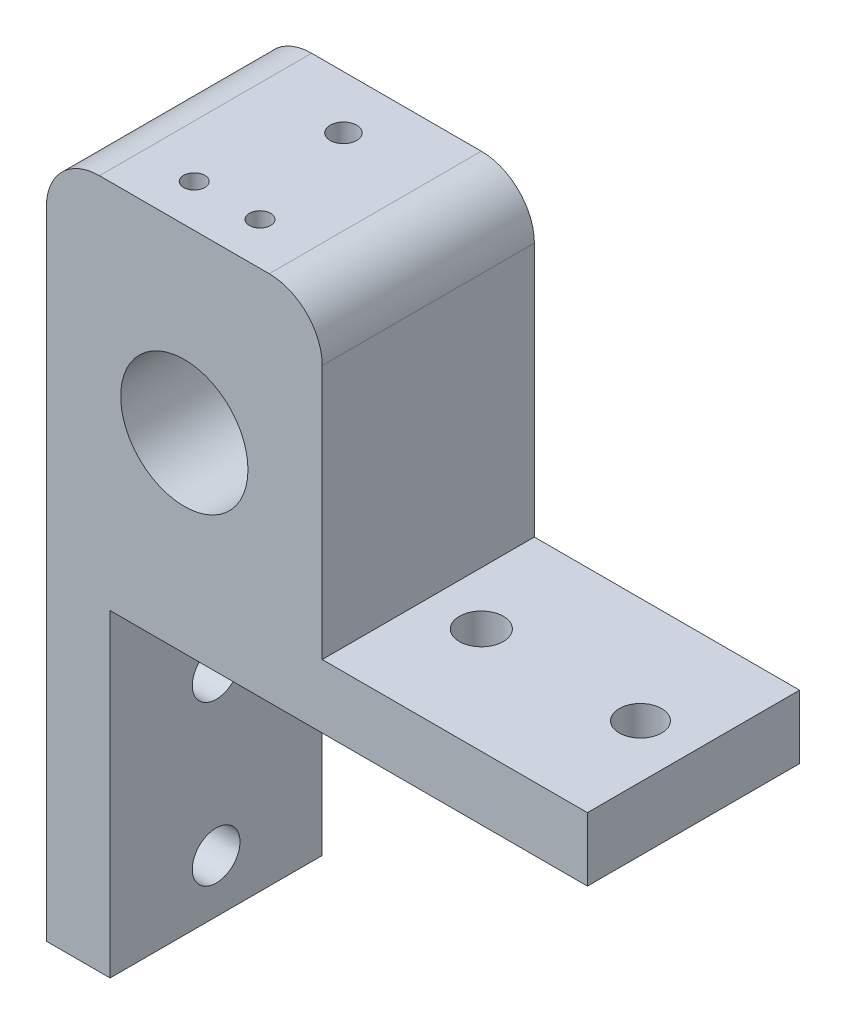
ISO-10303-21;
HEADER;
FILE_DESCRIPTION(('STEP AP214'),'2;1');
FILE_NAME('part.step','',(''),(''),'','','');
FILE_SCHEMA(('AUTOMOTIVE_DESIGN { 1 0 10303 214 1 1 1 1 }'));
ENDSEC;
DATA;
#1=APPLICATION_CONTEXT('core data for automotive mechanical design processes');
#2=APPLICATION_PROTOCOL_DEFINITION('international standard','automotive_design',2000,#1);
#3=PRODUCT_CONTEXT('',#1,'mechanical');
#4=PRODUCT('Part','Part','',(#3));
#5=PRODUCT_RELATED_PRODUCT_CATEGORY('part','',(#4));
#6=PRODUCT_DEFINITION_FORMATION('','',#4);
#7=PRODUCT_DEFINITION_CONTEXT('part definition',#1,'design');
#8=PRODUCT_DEFINITION('design','',#6,#7);
#9=PRODUCT_DEFINITION_SHAPE('','',#8);
#10=(LENGTH_UNIT() NAMED_UNIT(*) SI_UNIT(.MILLI.,.METRE.));
#11=(NAMED_UNIT(*) PLANE_ANGLE_UNIT() SI_UNIT($,.RADIAN.));
#12=(NAMED_UNIT(*) SI_UNIT($,.STERADIAN.) SOLID_ANGLE_UNIT());
#13=UNCERTAINTY_MEASURE_WITH_UNIT(LENGTH_MEASURE(1.E-05),#10,'distance_accuracy_value','');
#14=(GEOMETRIC_REPRESENTATION_CONTEXT(3) GLOBAL_UNCERTAINTY_ASSIGNED_CONTEXT((#13)) GLOBAL_UNIT_ASSIGNED_CONTEXT((#10,
#11,#12)) REPRESENTATION_CONTEXT('',''));
#15=CARTESIAN_POINT('',(0.,0.,0.));
#16=DIRECTION('',(0.,0.,1.));
#17=DIRECTION('',(1.,0.,0.));
#18=AXIS2_PLACEMENT_3D('',#15,#16,#17);
#19=CARTESIAN_POINT('',(0.,0.,20.));
#20=DIRECTION('',(0.,0.,1.));
#21=DIRECTION('',(1.,0.,0.));
#22=AXIS2_PLACEMENT_3D('',#19,#20,#21);
#23=PLANE('',#22);
#24=DIRECTION('',(-1.,0.,0.));
#25=VECTOR('',#24,1.);
#26=CARTESIAN_POINT('',(-13.,22.,20.));
#27=LINE('',#26,#25);
#28=CARTESIAN_POINT('',(7.99999999999999,22.,20.));
#29=VERTEX_POINT('',#28);
#30=CARTESIAN_POINT('',(-8.,22.,20.));
#31=VERTEX_POINT('',#30);
#32=EDGE_CURVE('E173',#29,#31,#27,.T.);
#33=ORIENTED_EDGE('',*,*,#32,.T.);
#34=CARTESIAN_POINT('',(-8.,17.,20.));
#35=DIRECTION('',(0.,0.,1.));
#36=DIRECTION('',(1.,0.,0.));
#37=AXIS2_PLACEMENT_3D('',#34,#35,#36);
#38=CIRCLE('',#37,5.);
#39=CARTESIAN_POINT('',(-13.,17.,20.));
#40=VERTEX_POINT('',#39);
#41=EDGE_CURVE('E41',#31,#40,#38,.T.);
#42=ORIENTED_EDGE('',*,*,#41,.T.);
#43=DIRECTION('',(0.,-1.,0.));
#44=VECTOR('',#43,1.);
#45=CARTESIAN_POINT('',(-13.,22.,20.));
#46=LINE('',#45,#44);
#47=CARTESIAN_POINT('',(-13.,-43.,20.));
#48=VERTEX_POINT('',#47);
#49=EDGE_CURVE('E171',#40,#48,#46,.T.);
#50=ORIENTED_EDGE('',*,*,#49,.T.);
#51=DIRECTION('',(1.,0.,0.));
#52=VECTOR('',#51,1.);
#53=CARTESIAN_POINT('',(-13.,-43.,20.));
#54=LINE('',#53,#52);
#55=CARTESIAN_POINT('',(-6.99999999999999,-43.,20.));
#56=VERTEX_POINT('',#55);
#57=EDGE_CURVE('E182',#48,#56,#54,.T.);
#58=ORIENTED_EDGE('',*,*,#57,.T.);
#59=DIRECTION('',(0.,1.,0.));
#60=VECTOR('',#59,1.);
#61=CARTESIAN_POINT('',(-7.,-13.,20.));
#62=LINE('',#61,#60);
#63=CARTESIAN_POINT('',(-7.,-13.,20.));
#64=VERTEX_POINT('',#63);
#65=EDGE_CURVE('E127',#56,#64,#62,.T.);
#66=ORIENTED_EDGE('',*,*,#65,.T.);
#67=DIRECTION('',(1.,0.,0.));
#68=VECTOR('',#67,1.);
#69=CARTESIAN_POINT('',(13.,-13.,20.));
#70=LINE('',#69,#68);
#71=CARTESIAN_POINT('',(38.,-13.,20.));
#72=VERTEX_POINT('',#71);
#73=EDGE_CURVE('E122',#64,#72,#70,.T.);
#74=ORIENTED_EDGE('',*,*,#73,.T.);
#75=DIRECTION('',(0.,1.,0.));
#76=VECTOR('',#75,1.);
#77=CARTESIAN_POINT('',(38.,-13.,20.));
#78=LINE('',#77,#76);
#79=CARTESIAN_POINT('',(38.,-7.,20.));
#80=VERTEX_POINT('',#79);
#81=EDGE_CURVE('E112',#72,#80,#78,.T.);
#82=ORIENTED_EDGE('',*,*,#81,.T.);
#83=DIRECTION('',(-1.,0.,0.));
#84=VECTOR('',#83,1.);
#85=CARTESIAN_POINT('',(13.,-7.,20.));
#86=LINE('',#85,#84);
#87=CARTESIAN_POINT('',(13.,-7.,20.));
#88=VERTEX_POINT('',#87);
#89=EDGE_CURVE('E121',#80,#88,#86,.T.);
#90=ORIENTED_EDGE('',*,*,#89,.T.);
#91=DIRECTION('',(0.,1.,0.));
#92=VECTOR('',#91,1.);
#93=CARTESIAN_POINT('',(13.,22.,20.));
#94=LINE('',#93,#92);
#95=CARTESIAN_POINT('',(13.,17.,20.));
#96=VERTEX_POINT('',#95);
#97=EDGE_CURVE('E215',#88,#96,#94,.T.);
#98=ORIENTED_EDGE('',*,*,#97,.T.);
#99=CARTESIAN_POINT('',(8.,17.,20.));
#100=DIRECTION('',(0.,0.,1.));
#101=DIRECTION('',(1.,0.,0.));
#102=AXIS2_PLACEMENT_3D('',#99,#100,#101);
#103=CIRCLE('',#102,5.);
#104=EDGE_CURVE('E168',#96,#29,#103,.T.);
#105=ORIENTED_EDGE('',*,*,#104,.T.);
#106=EDGE_LOOP('',(#33,#42,#50,#58,#66,#74,#82,#90,#98,#105));
#107=FACE_BOUND('',#106,.T.);
#108=CARTESIAN_POINT('',(0.,5.,20.));
#109=DIRECTION('',(0.,0.,1.));
#110=DIRECTION('',(1.,0.,0.));
#111=AXIS2_PLACEMENT_3D('',#108,#109,#110);
#112=CIRCLE('',#111,6.);
#113=CARTESIAN_POINT('',(6.,5.,20.));
#114=VERTEX_POINT('',#113);
#115=EDGE_CURVE('E227',#114,#114,#112,.T.);
#116=ORIENTED_EDGE('',*,*,#115,.F.);
#117=EDGE_LOOP('',(#116));
#118=FACE_BOUND('',#117,.T.);
#119=ADVANCED_FACE('F33',(#107,#118),#23,.T.);
#120=CARTESIAN_POINT('',(0.,0.,0.));
#121=DIRECTION('',(0.,0.,1.));
#122=DIRECTION('',(1.,0.,0.));
#123=AXIS2_PLACEMENT_3D('',#120,#121,#122);
#124=PLANE('',#123);
#125=DIRECTION('',(0.,-1.,0.));
#126=VECTOR('',#125,1.);
#127=CARTESIAN_POINT('',(-13.,-3.99999999999999,0.));
#128=LINE('',#127,#126);
#129=CARTESIAN_POINT('',(-13.,17.,0.));
#130=VERTEX_POINT('',#129);
#131=CARTESIAN_POINT('',(-13.,-43.,0.));
#132=VERTEX_POINT('',#131);
#133=EDGE_CURVE('E191',#130,#132,#128,.T.);
#134=ORIENTED_EDGE('',*,*,#133,.F.);
#135=CARTESIAN_POINT('',(-8.,17.,0.));
#136=DIRECTION('',(0.,0.,1.));
#137=DIRECTION('',(1.,0.,0.));
#138=AXIS2_PLACEMENT_3D('',#135,#136,#137);
#139=CIRCLE('',#138,5.);
#140=CARTESIAN_POINT('',(-8.,22.,0.));
#141=VERTEX_POINT('',#140);
#142=EDGE_CURVE('E162',#130,#141,#139,.F.);
#143=ORIENTED_EDGE('',*,*,#142,.T.);
#144=DIRECTION('',(-1.,0.,0.));
#145=VECTOR('',#144,1.);
#146=CARTESIAN_POINT('',(-13.,22.,0.));
#147=LINE('',#146,#145);
#148=CARTESIAN_POINT('',(7.99999999999999,22.,0.));
#149=VERTEX_POINT('',#148);
#150=EDGE_CURVE('E189',#149,#141,#147,.T.);
#151=ORIENTED_EDGE('',*,*,#150,.F.);
#152=CARTESIAN_POINT('',(8.,17.,0.));
#153=DIRECTION('',(0.,0.,1.));
#154=DIRECTION('',(1.,0.,0.));
#155=AXIS2_PLACEMENT_3D('',#152,#153,#154);
#156=CIRCLE('',#155,5.);
#157=CARTESIAN_POINT('',(13.,17.,0.));
#158=VERTEX_POINT('',#157);
#159=EDGE_CURVE('E139',#149,#158,#156,.F.);
#160=ORIENTED_EDGE('',*,*,#159,.T.);
#161=DIRECTION('',(0.,1.,0.));
#162=VECTOR('',#161,1.);
#163=CARTESIAN_POINT('',(13.,22.,0.));
#164=LINE('',#163,#162);
#165=CARTESIAN_POINT('',(13.,-7.,0.));
#166=VERTEX_POINT('',#165);
#167=EDGE_CURVE('E194',#166,#158,#164,.T.);
#168=ORIENTED_EDGE('',*,*,#167,.F.);
#169=DIRECTION('',(-1.,0.,0.));
#170=VECTOR('',#169,1.);
#171=CARTESIAN_POINT('',(13.,-7.,0.));
#172=LINE('',#171,#170);
#173=CARTESIAN_POINT('',(38.,-7.,0.));
#174=VERTEX_POINT('',#173);
#175=EDGE_CURVE('E198',#174,#166,#172,.T.);
#176=ORIENTED_EDGE('',*,*,#175,.F.);
#177=DIRECTION('',(0.,1.,0.));
#178=VECTOR('',#177,1.);
#179=CARTESIAN_POINT('',(38.,-13.,0.));
#180=LINE('',#179,#178);
#181=CARTESIAN_POINT('',(38.,-13.,0.));
#182=VERTEX_POINT('',#181);
#183=EDGE_CURVE('E226',#182,#174,#180,.T.);
#184=ORIENTED_EDGE('',*,*,#183,.F.);
#185=DIRECTION('',(1.,0.,0.));
#186=VECTOR('',#185,1.);
#187=CARTESIAN_POINT('',(-7.,-13.,0.));
#188=LINE('',#187,#186);
#189=CARTESIAN_POINT('',(-7.,-13.,0.));
#190=VERTEX_POINT('',#189);
#191=EDGE_CURVE('E131',#190,#182,#188,.T.);
#192=ORIENTED_EDGE('',*,*,#191,.F.);
#193=DIRECTION('',(0.,1.,0.));
#194=VECTOR('',#193,1.);
#195=CARTESIAN_POINT('',(-7.,-13.,0.));
#196=LINE('',#195,#194);
#197=CARTESIAN_POINT('',(-6.99999999999999,-43.,0.));
#198=VERTEX_POINT('',#197);
#199=EDGE_CURVE('E203',#198,#190,#196,.T.);
#200=ORIENTED_EDGE('',*,*,#199,.F.);
#201=DIRECTION('',(1.,0.,0.));
#202=VECTOR('',#201,1.);
#203=CARTESIAN_POINT('',(-13.,-43.,0.));
#204=LINE('',#203,#202);
#205=EDGE_CURVE('E196',#132,#198,#204,.T.);
#206=ORIENTED_EDGE('',*,*,#205,.F.);
#207=EDGE_LOOP('',(#134,#143,#151,#160,#168,#176,#184,#192,#200,#206));
#208=FACE_BOUND('',#207,.T.);
#209=CARTESIAN_POINT('',(0.,5.,0.));
#210=DIRECTION('',(0.,0.,1.));
#211=DIRECTION('',(1.,0.,0.));
#212=AXIS2_PLACEMENT_3D('',#209,#210,#211);
#213=CIRCLE('',#212,6.);
#214=CARTESIAN_POINT('',(6.,5.,0.));
#215=VERTEX_POINT('',#214);
#216=EDGE_CURVE('E152',#215,#215,#213,.T.);
#217=ORIENTED_EDGE('',*,*,#216,.T.);
#218=EDGE_LOOP('',(#217));
#219=FACE_BOUND('',#218,.T.);
#220=ADVANCED_FACE('F187',(#208,#219),#124,.F.);
#221=CARTESIAN_POINT('',(38.,-13.,20.));
#222=DIRECTION('',(-1.,0.,0.));
#223=DIRECTION('',(0.,-1.,0.));
#224=AXIS2_PLACEMENT_3D('',#221,#222,#223);
#225=PLANE('',#224);
#226=ORIENTED_EDGE('',*,*,#183,.T.);
#227=DIRECTION('',(0.,0.,-1.));
#228=VECTOR('',#227,1.);
#229=CARTESIAN_POINT('',(38.,-7.,20.));
#230=LINE('',#229,#228);
#231=EDGE_CURVE('E118',#80,#174,#230,.T.);
#232=ORIENTED_EDGE('',*,*,#231,.F.);
#233=ORIENTED_EDGE('',*,*,#81,.F.);
#234=DIRECTION('',(0.,0.,-1.));
#235=VECTOR('',#234,1.);
#236=CARTESIAN_POINT('',(38.,-13.,20.));
#237=LINE('',#236,#235);
#238=EDGE_CURVE('E116',#72,#182,#237,.T.);
#239=ORIENTED_EDGE('',*,*,#238,.T.);
#240=EDGE_LOOP('',(#226,#232,#233,#239));
#241=FACE_BOUND('',#240,.T.);
#242=ADVANCED_FACE('F114',(#241),#225,.F.);
#243=CARTESIAN_POINT('',(13.,-7.,20.));
#244=DIRECTION('',(0.,-1.,0.));
#245=DIRECTION('',(0.,0.,-1.));
#246=AXIS2_PLACEMENT_3D('',#243,#244,#245);
#247=PLANE('',#246);
#248=CARTESIAN_POINT('',(33.,-7.,10.));
#249=DIRECTION('',(0.,1.,0.));
#250=DIRECTION('',(0.,0.,1.));
#251=AXIS2_PLACEMENT_3D('',#248,#249,#250);
#252=CIRCLE('',#251,2.);
#253=CARTESIAN_POINT('',(33.,-7.,12.));
#254=VERTEX_POINT('',#253);
#255=EDGE_CURVE('E157',#254,#254,#252,.T.);
#256=ORIENTED_EDGE('',*,*,#255,.F.);
#257=EDGE_LOOP('',(#256));
#258=FACE_BOUND('',#257,.T.);
#259=CARTESIAN_POINT('',(18.,-7.,10.));
#260=DIRECTION('',(0.,1.,0.));
#261=DIRECTION('',(0.,0.,1.));
#262=AXIS2_PLACEMENT_3D('',#259,#260,#261);
#263=CIRCLE('',#262,2.07036437574447);
#264=CARTESIAN_POINT('',(18.,-7.,12.0703643757445));
#265=VERTEX_POINT('',#264);
#266=EDGE_CURVE('E238',#265,#265,#263,.T.);
#267=ORIENTED_EDGE('',*,*,#266,.F.);
#268=EDGE_LOOP('',(#267));
#269=FACE_BOUND('',#268,.T.);
#270=ORIENTED_EDGE('',*,*,#175,.T.);
#271=DIRECTION('',(0.,0.,-1.));
#272=VECTOR('',#271,1.);
#273=CARTESIAN_POINT('',(13.,-7.,20.));
#274=LINE('',#273,#272);
#275=EDGE_CURVE('E141',#88,#166,#274,.T.);
#276=ORIENTED_EDGE('',*,*,#275,.F.);
#277=ORIENTED_EDGE('',*,*,#89,.F.);
#278=ORIENTED_EDGE('',*,*,#231,.T.);
#279=EDGE_LOOP('',(#270,#276,#277,#278));
#280=FACE_BOUND('',#279,.T.);
#281=ADVANCED_FACE('F228',(#258,#269,#280),#247,.F.);
#282=CARTESIAN_POINT('',(13.,22.,20.));
#283=DIRECTION('',(-1.,0.,0.));
#284=DIRECTION('',(0.,-1.,0.));
#285=AXIS2_PLACEMENT_3D('',#282,#283,#284);
#286=PLANE('',#285);
#287=ORIENTED_EDGE('',*,*,#167,.T.);
#288=DIRECTION('',(0.,0.,-1.));
#289=VECTOR('',#288,1.);
#290=CARTESIAN_POINT('',(13.,17.,20.));
#291=LINE('',#290,#289);
#292=EDGE_CURVE('E11',#158,#96,#291,.F.);
#293=ORIENTED_EDGE('',*,*,#292,.T.);
#294=ORIENTED_EDGE('',*,*,#97,.F.);
#295=ORIENTED_EDGE('',*,*,#275,.T.);
#296=EDGE_LOOP('',(#287,#293,#294,#295));
#297=FACE_BOUND('',#296,.T.);
#298=ADVANCED_FACE('F214',(#297),#286,.F.);
#299=CARTESIAN_POINT('',(-13.,22.,20.));
#300=DIRECTION('',(0.,-1.,0.));
#301=DIRECTION('',(0.,0.,-1.));
#302=AXIS2_PLACEMENT_3D('',#299,#300,#301);
#303=PLANE('',#302);
#304=CARTESIAN_POINT('',(3.13217874254306,22.,16.));
#305=DIRECTION('',(0.,1.,0.));
#306=DIRECTION('',(0.,0.,1.));
#307=AXIS2_PLACEMENT_3D('',#304,#305,#306);
#308=CIRCLE('',#307,1.);
#309=CARTESIAN_POINT('',(3.13217874254306,22.,17.));
#310=VERTEX_POINT('',#309);
#311=EDGE_CURVE('E494',#310,#310,#308,.T.);
#312=ORIENTED_EDGE('',*,*,#311,.F.);
#313=EDGE_LOOP('',(#312));
#314=FACE_BOUND('',#313,.T.);
#315=CARTESIAN_POINT('',(-3.06782125745694,22.,16.));
#316=DIRECTION('',(0.,1.,0.));
#317=DIRECTION('',(0.,0.,1.));
#318=AXIS2_PLACEMENT_3D('',#315,#316,#317);
#319=CIRCLE('',#318,1.);
#320=CARTESIAN_POINT('',(-3.06782125745694,22.,17.));
#321=VERTEX_POINT('',#320);
#322=EDGE_CURVE('E497',#321,#321,#319,.T.);
#323=ORIENTED_EDGE('',*,*,#322,.F.);
#324=EDGE_LOOP('',(#323));
#325=FACE_BOUND('',#324,.T.);
#326=CARTESIAN_POINT('',(0.,22.,5.));
#327=DIRECTION('',(0.,1.,0.));
#328=DIRECTION('',(0.,0.,1.));
#329=AXIS2_PLACEMENT_3D('',#326,#327,#328);
#330=CIRCLE('',#329,1.25);
#331=CARTESIAN_POINT('',(0.,22.,6.25));
#332=VERTEX_POINT('',#331);
#333=EDGE_CURVE('E241',#332,#332,#330,.T.);
#334=ORIENTED_EDGE('',*,*,#333,.F.);
#335=EDGE_LOOP('',(#334));
#336=FACE_BOUND('',#335,.T.);
#337=ORIENTED_EDGE('',*,*,#150,.T.);
#338=DIRECTION('',(0.,0.,-1.));
#339=VECTOR('',#338,1.);
#340=CARTESIAN_POINT('',(-8.,22.,20.));
#341=LINE('',#340,#339);
#342=EDGE_CURVE('E54',#141,#31,#341,.F.);
#343=ORIENTED_EDGE('',*,*,#342,.T.);
#344=ORIENTED_EDGE('',*,*,#32,.F.);
#345=DIRECTION('',(0.,0.,-1.));
#346=VECTOR('',#345,1.);
#347=CARTESIAN_POINT('',(8.,22.,20.));
#348=LINE('',#347,#346);
#349=EDGE_CURVE('E164',#29,#149,#348,.T.);
#350=ORIENTED_EDGE('',*,*,#349,.T.);
#351=EDGE_LOOP('',(#337,#343,#344,#350));
#352=FACE_BOUND('',#351,.T.);
#353=ADVANCED_FACE('F192',(#314,#325,#336,#352),#303,.F.);
#354=CARTESIAN_POINT('',(-13.,-3.99999999999999,20.));
#355=DIRECTION('',(1.,0.,0.));
#356=DIRECTION('',(0.,1.,0.));
#357=AXIS2_PLACEMENT_3D('',#354,#355,#356);
#358=PLANE('',#357);
#359=CARTESIAN_POINT('',(-13.,-38.,10.));
#360=DIRECTION('',(-1.,0.,0.));
#361=DIRECTION('',(0.,-1.,0.));
#362=AXIS2_PLACEMENT_3D('',#359,#360,#361);
#363=CIRCLE('',#362,2.25);
#364=CARTESIAN_POINT('',(-13.,-40.25,10.));
#365=VERTEX_POINT('',#364);
#366=EDGE_CURVE('E149',#365,#365,#363,.T.);
#367=ORIENTED_EDGE('',*,*,#366,.F.);
#368=EDGE_LOOP('',(#367));
#369=FACE_BOUND('',#368,.T.);
#370=CARTESIAN_POINT('',(-13.,-23.,10.));
#371=DIRECTION('',(-1.,0.,0.));
#372=DIRECTION('',(0.,-1.,0.));
#373=AXIS2_PLACEMENT_3D('',#370,#371,#372);
#374=CIRCLE('',#373,2.25);
#375=CARTESIAN_POINT('',(-13.,-25.25,10.));
#376=VERTEX_POINT('',#375);
#377=EDGE_CURVE('E159',#376,#376,#374,.T.);
#378=ORIENTED_EDGE('',*,*,#377,.F.);
#379=EDGE_LOOP('',(#378));
#380=FACE_BOUND('',#379,.T.);
#381=ORIENTED_EDGE('',*,*,#49,.F.);
#382=DIRECTION('',(0.,0.,-1.));
#383=VECTOR('',#382,1.);
#384=CARTESIAN_POINT('',(-13.,17.,20.));
#385=LINE('',#384,#383);
#386=EDGE_CURVE('E136',#40,#130,#385,.T.);
#387=ORIENTED_EDGE('',*,*,#386,.T.);
#388=ORIENTED_EDGE('',*,*,#133,.T.);
#389=DIRECTION('',(0.,0.,-1.));
#390=VECTOR('',#389,1.);
#391=CARTESIAN_POINT('',(-13.,-43.,20.));
#392=LINE('',#391,#390);
#393=EDGE_CURVE('E180',#48,#132,#392,.T.);
#394=ORIENTED_EDGE('',*,*,#393,.F.);
#395=EDGE_LOOP('',(#381,#387,#388,#394));
#396=FACE_BOUND('',#395,.T.);
#397=ADVANCED_FACE('F177',(#369,#380,#396),#358,.F.);
#398=CARTESIAN_POINT('',(-13.,-43.,20.));
#399=DIRECTION('',(0.,1.,0.));
#400=DIRECTION('',(0.,0.,1.));
#401=AXIS2_PLACEMENT_3D('',#398,#399,#400);
#402=PLANE('',#401);
#403=ORIENTED_EDGE('',*,*,#205,.T.);
#404=DIRECTION('',(0.,0.,-1.));
#405=VECTOR('',#404,1.);
#406=CARTESIAN_POINT('',(-6.99999999999999,-43.,20.));
#407=LINE('',#406,#405);
#408=EDGE_CURVE('E208',#56,#198,#407,.T.);
#409=ORIENTED_EDGE('',*,*,#408,.F.);
#410=ORIENTED_EDGE('',*,*,#57,.F.);
#411=ORIENTED_EDGE('',*,*,#393,.T.);
#412=EDGE_LOOP('',(#403,#409,#410,#411));
#413=FACE_BOUND('',#412,.T.);
#414=ADVANCED_FACE('F292',(#413),#402,.F.);
#415=CARTESIAN_POINT('',(-7.,-13.,20.));
#416=DIRECTION('',(-1.,0.,0.));
#417=DIRECTION('',(0.,-1.,0.));
#418=AXIS2_PLACEMENT_3D('',#415,#416,#417);
#419=PLANE('',#418);
#420=CARTESIAN_POINT('',(-6.99999999999999,-38.,10.));
#421=DIRECTION('',(-1.,0.,0.));
#422=DIRECTION('',(0.,-1.,0.));
#423=AXIS2_PLACEMENT_3D('',#420,#421,#422);
#424=CIRCLE('',#423,2.25);
#425=CARTESIAN_POINT('',(-6.99999999999999,-40.25,10.));
#426=VERTEX_POINT('',#425);
#427=EDGE_CURVE('E148',#426,#426,#424,.T.);
#428=ORIENTED_EDGE('',*,*,#427,.T.);
#429=EDGE_LOOP('',(#428));
#430=FACE_BOUND('',#429,.T.);
#431=CARTESIAN_POINT('',(-7.,-23.,10.));
#432=DIRECTION('',(-1.,0.,0.));
#433=DIRECTION('',(0.,-1.,0.));
#434=AXIS2_PLACEMENT_3D('',#431,#432,#433);
#435=CIRCLE('',#434,2.25);
#436=CARTESIAN_POINT('',(-7.,-25.25,10.));
#437=VERTEX_POINT('',#436);
#438=EDGE_CURVE('E145',#437,#437,#435,.T.);
#439=ORIENTED_EDGE('',*,*,#438,.T.);
#440=EDGE_LOOP('',(#439));
#441=FACE_BOUND('',#440,.T.);
#442=ORIENTED_EDGE('',*,*,#199,.T.);
#443=DIRECTION('',(0.,0.,-1.));
#444=VECTOR('',#443,1.);
#445=CARTESIAN_POINT('',(-7.,-13.,20.));
#446=LINE('',#445,#444);
#447=EDGE_CURVE('E206',#64,#190,#446,.T.);
#448=ORIENTED_EDGE('',*,*,#447,.F.);
#449=ORIENTED_EDGE('',*,*,#65,.F.);
#450=ORIENTED_EDGE('',*,*,#408,.T.);
#451=EDGE_LOOP('',(#442,#448,#449,#450));
#452=FACE_BOUND('',#451,.T.);
#453=ADVANCED_FACE('F288',(#430,#441,#452),#419,.F.);
#454=CARTESIAN_POINT('',(-7.,-13.,20.));
#455=DIRECTION('',(0.,1.,0.));
#456=DIRECTION('',(0.,0.,1.));
#457=AXIS2_PLACEMENT_3D('',#454,#455,#456);
#458=PLANE('',#457);
#459=CARTESIAN_POINT('',(33.,-13.,10.));
#460=DIRECTION('',(0.,1.,0.));
#461=DIRECTION('',(0.,0.,1.));
#462=AXIS2_PLACEMENT_3D('',#459,#460,#461);
#463=CIRCLE('',#462,2.);
#464=CARTESIAN_POINT('',(33.,-13.,12.));
#465=VERTEX_POINT('',#464);
#466=EDGE_CURVE('E156',#465,#465,#463,.T.);
#467=ORIENTED_EDGE('',*,*,#466,.T.);
#468=EDGE_LOOP('',(#467));
#469=FACE_BOUND('',#468,.T.);
#470=CARTESIAN_POINT('',(18.,-13.,10.));
#471=DIRECTION('',(0.,1.,0.));
#472=DIRECTION('',(0.,0.,1.));
#473=AXIS2_PLACEMENT_3D('',#470,#471,#472);
#474=CIRCLE('',#473,2.07036437574447);
#475=CARTESIAN_POINT('',(18.,-13.,12.0703643757445));
#476=VERTEX_POINT('',#475);
#477=EDGE_CURVE('E153',#476,#476,#474,.T.);
#478=ORIENTED_EDGE('',*,*,#477,.T.);
#479=EDGE_LOOP('',(#478));
#480=FACE_BOUND('',#479,.T.);
#481=ORIENTED_EDGE('',*,*,#191,.T.);
#482=ORIENTED_EDGE('',*,*,#238,.F.);
#483=ORIENTED_EDGE('',*,*,#73,.F.);
#484=ORIENTED_EDGE('',*,*,#447,.T.);
#485=EDGE_LOOP('',(#481,#482,#483,#484));
#486=FACE_BOUND('',#485,.T.);
#487=ADVANCED_FACE('F133',(#469,#480,#486),#458,.F.);
#488=CARTESIAN_POINT('',(0.,5.,20.));
#489=DIRECTION('',(0.,0.,-1.));
#490=DIRECTION('',(-1.,0.,0.));
#491=AXIS2_PLACEMENT_3D('',#488,#489,#490);
#492=CYLINDRICAL_SURFACE('',#491,6.);
#493=CARTESIAN_POINT('',(0.,11.,6.25));
#494=CARTESIAN_POINT('',(0.0694090417016607,10.9999987152665,6.24999752253078));
#495=CARTESIAN_POINT('',(0.138848789520876,10.9987832877504,6.24419933428125));
#496=CARTESIAN_POINT('',(0.275761316266993,10.9940520099068,6.22118065046715));
#497=CARTESIAN_POINT('',(0.343232560128313,10.9905344118925,6.20395147696307));
#498=CARTESIAN_POINT('',(0.474209132291342,10.981591091962,6.15862954507818));
#499=CARTESIAN_POINT('',(0.537718336709185,10.9761672705265,6.13054760400111));
#500=CARTESIAN_POINT('',(0.659120328605959,10.9639992780986,6.06435039114382));
#501=CARTESIAN_POINT('',(0.717013367534327,10.9572551662597,6.02623556884417));
#502=CARTESIAN_POINT('',(0.826390324308838,10.9430770002465,5.94046365980936));
#503=CARTESIAN_POINT('',(0.877780244162686,10.9356350584853,5.89268799876492));
#504=CARTESIAN_POINT('',(0.971877776769394,10.9209565769245,5.78920534080489));
#505=CARTESIAN_POINT('',(1.01458467096099,10.9137200541668,5.73349768812774));
#506=CARTESIAN_POINT('',(1.09051031677217,10.9001944259531,5.61504803123384));
#507=CARTESIAN_POINT('',(1.12363054680651,10.8939154517483,5.55224161549726));
#508=CARTESIAN_POINT('',(1.17881119348064,10.8831284065002,5.42180254822724));
#509=CARTESIAN_POINT('',(1.20087280167641,10.8786201446757,5.35417041755746));
#510=CARTESIAN_POINT('',(1.23300240133737,10.8719650098612,5.21701476258436));
#511=CARTESIAN_POINT('',(1.24323597696799,10.8697855685587,5.14753164066523));
#512=CARTESIAN_POINT('',(1.25193357655615,10.8679369071649,5.00780315713737));
#513=CARTESIAN_POINT('',(1.25039890894687,10.8682674080098,4.9375578811347));
#514=CARTESIAN_POINT('',(1.23573719037197,10.8713717431917,4.79951897202482));
#515=CARTESIAN_POINT('',(1.2228010523272,10.874105336799,4.73170402033879));
#516=CARTESIAN_POINT('',(1.18600543529945,10.8816443761594,4.59922849035507));
#517=CARTESIAN_POINT('',(1.16214539481382,10.8864499284132,4.53456807439367));
#518=CARTESIAN_POINT('',(1.10400003213928,10.897631914641,4.40969277158402));
#519=CARTESIAN_POINT('',(1.06964002534237,10.9040195378559,4.34951370347293));
#520=CARTESIAN_POINT('',(0.991522699274819,10.9176389001072,4.23570425573184));
#521=CARTESIAN_POINT('',(0.947764212262589,10.9248707439854,4.18207469116402));
#522=CARTESIAN_POINT('',(0.851074921546784,10.9395373092991,4.08178603891963));
#523=CARTESIAN_POINT('',(0.797981433412083,10.9469732319947,4.03528383110299));
#524=CARTESIAN_POINT('',(0.684667288611798,10.96108088143,3.95181955777103));
#525=CARTESIAN_POINT('',(0.624446525025766,10.9677525967024,3.9148576354016));
#526=CARTESIAN_POINT('',(0.498405541235479,10.9795987094281,3.85148991846405));
#527=CARTESIAN_POINT('',(0.4325754619265,10.9847703971026,3.82510319543288));
#528=CARTESIAN_POINT('',(0.297284620972155,10.9930133821128,3.78380829516451));
#529=CARTESIAN_POINT('',(0.22782433859509,10.9960849559605,3.7688986067686));
#530=CARTESIAN_POINT('',(0.0885918657008355,10.9997427521546,3.75120574793211));
#531=CARTESIAN_POINT('',(0.018848055526179,11.0003729353758,3.74820805850575));
#532=CARTESIAN_POINT('',(-0.120143798757714,10.9991995225277,3.7538449499691));
#533=CARTESIAN_POINT('',(-0.189391872962258,10.9973960754815,3.7624788186016));
#534=CARTESIAN_POINT('',(-0.324726367119814,10.9915856497918,3.79095565346953));
#535=CARTESIAN_POINT('',(-0.390837192894207,10.9876005286808,3.81068748538347));
#536=CARTESIAN_POINT('',(-0.518811446661332,10.9778722724239,3.86067786042141));
#537=CARTESIAN_POINT('',(-0.580674536336776,10.9721289974458,3.89093724086598));
#538=CARTESIAN_POINT('',(-0.699294306943495,10.9594124149071,3.96158037823756));
#539=CARTESIAN_POINT('',(-0.755973219469835,10.9524239381233,4.00209192956906));
#540=CARTESIAN_POINT('',(-0.861805445886521,10.9380256829971,4.09191956307627));
#541=CARTESIAN_POINT('',(-0.910957877913286,10.9306158554251,4.14123667551894));
#542=CARTESIAN_POINT('',(-1.0011786486518,10.9160602453138,4.2482555769997));
#543=CARTESIAN_POINT('',(-1.04209914600204,10.908920893075,4.30608303195528));
#544=CARTESIAN_POINT('',(-1.11364719079244,10.8958560101581,4.42791628421379));
#545=CARTESIAN_POINT('',(-1.14427516677864,10.8899304289465,4.49192182413911));
#546=CARTESIAN_POINT('',(-1.19417246443922,10.8800170070804,4.62396119629823));
#547=CARTESIAN_POINT('',(-1.21350309828032,10.8760187278469,4.69197103716584));
#548=CARTESIAN_POINT('',(-1.24044038523407,10.870391847097,4.83036655049226));
#549=CARTESIAN_POINT('',(-1.24804871544441,10.8687629066037,4.90075188161944));
#550=CARTESIAN_POINT('',(-1.25125926487611,10.8680790730851,5.04041340099965));
#551=CARTESIAN_POINT('',(-1.24709542622726,10.868974023215,5.10968407022205));
#552=CARTESIAN_POINT('',(-1.22739905314032,10.8731244725493,5.24651400892022));
#553=CARTESIAN_POINT('',(-1.21186662782266,10.8763799490963,5.31407329481611));
#554=CARTESIAN_POINT('',(-1.16998217768585,10.8848613244772,5.44539777189066));
#555=CARTESIAN_POINT('',(-1.14366117568421,10.8900815700793,5.50917324648693));
#556=CARTESIAN_POINT('',(-1.08097457299757,10.9019070573874,5.63143877602667));
#557=CARTESIAN_POINT('',(-1.0446080398303,10.9085124276546,5.68992833963313));
#558=CARTESIAN_POINT('',(-0.962073695342412,10.9225157955115,5.80112162707945));
#559=CARTESIAN_POINT('',(-0.915737890418227,10.929926138684,5.85369912456499));
#560=CARTESIAN_POINT('',(-0.814924438115335,10.9446183958321,5.95040949322636));
#561=CARTESIAN_POINT('',(-0.760444918832969,10.9519002798488,5.99454041755149));
#562=CARTESIAN_POINT('',(-0.644134427507704,10.9656144454764,6.07358857318406));
#563=CARTESIAN_POINT('',(-0.582225921521349,10.9720359607324,6.10839367988629));
#564=CARTESIAN_POINT('',(-0.453319843998454,10.9831990849409,6.16705022843002));
#565=CARTESIAN_POINT('',(-0.386326781907244,10.987942161821,6.19091124718188));
#566=CARTESIAN_POINT('',(-0.266015292900106,10.9943249978144,6.22254027828843));
#567=CARTESIAN_POINT('',(-0.21336759372793,10.9964403566139,6.23281876320886));
#568=CARTESIAN_POINT('',(-0.107152674176537,10.9992783278976,6.24654945427733));
#569=CARTESIAN_POINT('',(-0.0535854878488721,11.0000009918459,6.25000191266719));
#570=CARTESIAN_POINT('',(0.,11.,6.25));
#571=B_SPLINE_CURVE_WITH_KNOTS('',3,(#493,#494,#495,#496,#497,#498,#499,#500,#501,#502,#503,
#504,#505,#506,#507,#508,#509,#510,#511,#512,#513,#514,#515,#516,#517,#518,#519,#520,#521,#522,
#523,#524,#525,#526,#527,#528,#529,#530,#531,#532,#533,#534,#535,#536,#537,#538,#539,#540,#541,
#542,#543,#544,#545,#546,#547,#548,#549,#550,#551,#552,#553,#554,#555,#556,#557,#558,#559,#560,
#561,#562,#563,#564,#565,#566,#567,#568,#569,#570),.UNSPECIFIED.,.T.,.F.,(4,2,2,2,2,2,2,2,2,2,2,
2,2,2,2,2,2,2,2,2,2,2,2,2,2,2,2,2,2,2,2,2,2,2,2,2,2,2,4),(0.,0.208031045103183,
0.416220199906225,0.624202378825443,0.832175241572991,1.04287526388123,1.25359271551786,
1.46640449178549,1.6791933328549,1.88896575169854,2.09871484767165,2.3050171212906,
2.5113300003028,2.71914592416749,2.92698768368035,3.13889526355466,3.35080602278218,
3.56309724499663,3.77536051045772,3.98378339407676,4.19219351552278,4.39855286632622,
4.60492863390934,4.81401583995737,5.02312752564574,5.23571263829337,5.4482888985131,
5.65970050095025,5.87108185414185,6.07829223291039,6.28550062281362,6.49211731393256,
6.6987531908148,6.9091902483031,7.1196757511737,7.33258864398257,7.54531486464974,
7.7059258847728,7.86653096973392),.UNSPECIFIED.);
#572=CARTESIAN_POINT('',(0.,11.,6.25));
#573=VERTEX_POINT('',#572);
#574=EDGE_CURVE('E244',#573,#573,#571,.T.);
#575=ORIENTED_EDGE('',*,*,#574,.T.);
#576=EDGE_LOOP('',(#575));
#577=FACE_BOUND('',#576,.T.);
#578=ORIENTED_EDGE('',*,*,#115,.T.);
#579=EDGE_LOOP('',(#578));
#580=FACE_BOUND('',#579,.T.);
#581=ORIENTED_EDGE('',*,*,#216,.F.);
#582=EDGE_LOOP('',(#581));
#583=FACE_BOUND('',#582,.T.);
#584=ADVANCED_FACE('F283',(#577,#580,#583),#492,.F.);
#585=CARTESIAN_POINT('',(7.,-23.,10.));
#586=DIRECTION('',(-1.,0.,0.));
#587=DIRECTION('',(0.,-1.,0.));
#588=AXIS2_PLACEMENT_3D('',#585,#586,#587);
#589=CYLINDRICAL_SURFACE('',#588,2.25);
#590=ORIENTED_EDGE('',*,*,#377,.T.);
#591=EDGE_LOOP('',(#590));
#592=FACE_BOUND('',#591,.T.);
#593=ORIENTED_EDGE('',*,*,#438,.F.);
#594=EDGE_LOOP('',(#593));
#595=FACE_BOUND('',#594,.T.);
#596=ADVANCED_FACE('F326',(#592,#595),#589,.F.);
#597=CARTESIAN_POINT('',(7.,-38.,10.));
#598=DIRECTION('',(-1.,0.,0.));
#599=DIRECTION('',(0.,-1.,0.));
#600=AXIS2_PLACEMENT_3D('',#597,#598,#599);
#601=CYLINDRICAL_SURFACE('',#600,2.25);
#602=ORIENTED_EDGE('',*,*,#366,.T.);
#603=EDGE_LOOP('',(#602));
#604=FACE_BOUND('',#603,.T.);
#605=ORIENTED_EDGE('',*,*,#427,.F.);
#606=EDGE_LOOP('',(#605));
#607=FACE_BOUND('',#606,.T.);
#608=ADVANCED_FACE('F320',(#604,#607),#601,.F.);
#609=CARTESIAN_POINT('',(18.,-27.,10.));
#610=DIRECTION('',(0.,1.,0.));
#611=DIRECTION('',(0.,0.,1.));
#612=AXIS2_PLACEMENT_3D('',#609,#610,#611);
#613=CYLINDRICAL_SURFACE('',#612,2.07036437574447);
#614=ORIENTED_EDGE('',*,*,#266,.T.);
#615=EDGE_LOOP('',(#614));
#616=FACE_BOUND('',#615,.T.);
#617=ORIENTED_EDGE('',*,*,#477,.F.);
#618=EDGE_LOOP('',(#617));
#619=FACE_BOUND('',#618,.T.);
#620=ADVANCED_FACE('F315',(#616,#619),#613,.F.);
#621=CARTESIAN_POINT('',(33.,-27.,10.));
#622=DIRECTION('',(0.,1.,0.));
#623=DIRECTION('',(0.,0.,1.));
#624=AXIS2_PLACEMENT_3D('',#621,#622,#623);
#625=CYLINDRICAL_SURFACE('',#624,2.);
#626=ORIENTED_EDGE('',*,*,#255,.T.);
#627=EDGE_LOOP('',(#626));
#628=FACE_BOUND('',#627,.T.);
#629=ORIENTED_EDGE('',*,*,#466,.F.);
#630=EDGE_LOOP('',(#629));
#631=FACE_BOUND('',#630,.T.);
#632=ADVANCED_FACE('F310',(#628,#631),#625,.F.);
#633=CARTESIAN_POINT('',(-8.,17.,20.));
#634=DIRECTION('',(0.,0.,-1.));
#635=DIRECTION('',(-1.,0.,0.));
#636=AXIS2_PLACEMENT_3D('',#633,#634,#635);
#637=CYLINDRICAL_SURFACE('',#636,5.);
#638=ORIENTED_EDGE('',*,*,#41,.F.);
#639=ORIENTED_EDGE('',*,*,#342,.F.);
#640=ORIENTED_EDGE('',*,*,#142,.F.);
#641=ORIENTED_EDGE('',*,*,#386,.F.);
#642=EDGE_LOOP('',(#638,#639,#640,#641));
#643=FACE_BOUND('',#642,.T.);
#644=ADVANCED_FACE('F184',(#643),#637,.T.);
#645=CARTESIAN_POINT('',(8.,17.,20.));
#646=DIRECTION('',(0.,0.,-1.));
#647=DIRECTION('',(-1.,0.,0.));
#648=AXIS2_PLACEMENT_3D('',#645,#646,#647);
#649=CYLINDRICAL_SURFACE('',#648,5.);
#650=ORIENTED_EDGE('',*,*,#104,.F.);
#651=ORIENTED_EDGE('',*,*,#292,.F.);
#652=ORIENTED_EDGE('',*,*,#159,.F.);
#653=ORIENTED_EDGE('',*,*,#349,.F.);
#654=EDGE_LOOP('',(#650,#651,#652,#653));
#655=FACE_BOUND('',#654,.T.);
#656=ADVANCED_FACE('F35',(#655),#649,.T.);
#657=CARTESIAN_POINT('',(0.,-43.001,5.));
#658=DIRECTION('',(0.,1.,0.));
#659=DIRECTION('',(0.,0.,1.));
#660=AXIS2_PLACEMENT_3D('',#657,#658,#659);
#661=CYLINDRICAL_SURFACE('',#660,1.25);
#662=ORIENTED_EDGE('',*,*,#574,.F.);
#663=EDGE_LOOP('',(#662));
#664=FACE_BOUND('',#663,.T.);
#665=ORIENTED_EDGE('',*,*,#333,.T.);
#666=EDGE_LOOP('',(#665));
#667=FACE_BOUND('',#666,.T.);
#668=ADVANCED_FACE('F253',(#664,#667),#661,.F.);
#669=CARTESIAN_POINT('',(-3.06782125745694,12.,16.));
#670=DIRECTION('',(0.,1.,0.));
#671=DIRECTION('',(0.,0.,1.));
#672=AXIS2_PLACEMENT_3D('',#669,#670,#671);
#673=CYLINDRICAL_SURFACE('',#672,1.);
#674=CARTESIAN_POINT('',(-3.06782125745694,12.,16.));
#675=DIRECTION('',(0.,1.,0.));
#676=DIRECTION('',(0.,0.,1.));
#677=AXIS2_PLACEMENT_3D('',#674,#675,#676);
#678=CIRCLE('',#677,1.);
#679=CARTESIAN_POINT('',(-3.06782125745694,12.,17.));
#680=VERTEX_POINT('',#679);
#681=EDGE_CURVE('E499',#680,#680,#678,.T.);
#682=ORIENTED_EDGE('',*,*,#681,.F.);
#683=EDGE_LOOP('',(#682));
#684=FACE_BOUND('',#683,.T.);
#685=ORIENTED_EDGE('',*,*,#322,.T.);
#686=EDGE_LOOP('',(#685));
#687=FACE_BOUND('',#686,.T.);
#688=ADVANCED_FACE('F258',(#684,#687),#673,.F.);
#689=CARTESIAN_POINT('',(-3.06782125745694,12.,16.));
#690=DIRECTION('',(0.,1.,0.));
#691=DIRECTION('',(0.,0.,1.));
#692=AXIS2_PLACEMENT_3D('',#689,#690,#691);
#693=PLANE('',#692);
#694=ORIENTED_EDGE('',*,*,#681,.T.);
#695=EDGE_LOOP('',(#694));
#696=FACE_BOUND('',#695,.T.);
#697=ADVANCED_FACE('F261',(#696),#693,.T.);
#698=CARTESIAN_POINT('',(3.13217874254306,12.,16.));
#699=DIRECTION('',(0.,1.,0.));
#700=DIRECTION('',(0.,0.,1.));
#701=AXIS2_PLACEMENT_3D('',#698,#699,#700);
#702=CYLINDRICAL_SURFACE('',#701,1.);
#703=CARTESIAN_POINT('',(3.13217874254306,12.,16.));
#704=DIRECTION('',(0.,1.,0.));
#705=DIRECTION('',(0.,0.,1.));
#706=AXIS2_PLACEMENT_3D('',#703,#704,#705);
#707=CIRCLE('',#706,1.);
#708=CARTESIAN_POINT('',(3.13217874254306,12.,17.));
#709=VERTEX_POINT('',#708);
#710=EDGE_CURVE('E251',#709,#709,#707,.T.);
#711=ORIENTED_EDGE('',*,*,#710,.F.);
#712=EDGE_LOOP('',(#711));
#713=FACE_BOUND('',#712,.T.);
#714=ORIENTED_EDGE('',*,*,#311,.T.);
#715=EDGE_LOOP('',(#714));
#716=FACE_BOUND('',#715,.T.);
#717=ADVANCED_FACE('F265',(#713,#716),#702,.F.);
#718=CARTESIAN_POINT('',(3.13217874254306,12.,16.));
#719=DIRECTION('',(0.,1.,0.));
#720=DIRECTION('',(0.,0.,1.));
#721=AXIS2_PLACEMENT_3D('',#718,#719,#720);
#722=PLANE('',#721);
#723=ORIENTED_EDGE('',*,*,#710,.T.);
#724=EDGE_LOOP('',(#723));
#725=FACE_BOUND('',#724,.T.);
#726=ADVANCED_FACE('F269',(#725),#722,.T.);
#727=CLOSED_SHELL('',(#119,#220,#242,#281,#298,#353,#397,#414,#453,#487,#584,#596,#608,#620,
#632,#644,#656,#668,#688,#697,#717,#726));
#728=MANIFOLD_SOLID_BREP('B2',#727);
#729=ADVANCED_BREP_SHAPE_REPRESENTATION('',(#18,#728),#14);
#730=SHAPE_DEFINITION_REPRESENTATION(#9,#729);
ENDSEC;
END-ISO-10303-21;
